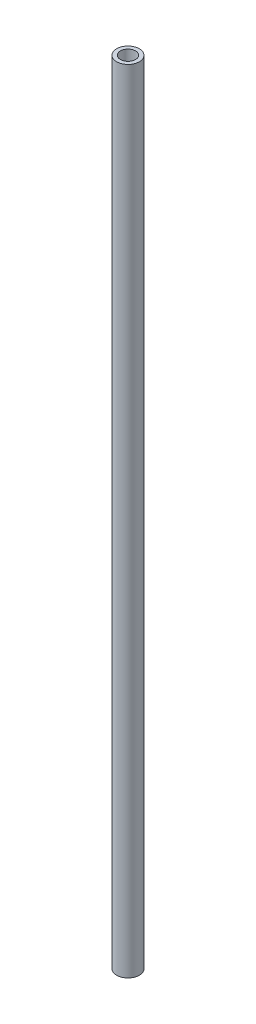
ISO-10303-21;
HEADER;
FILE_DESCRIPTION(('STEP AP214'),'2;1');
FILE_NAME('part.step','',(''),(''),'','','');
FILE_SCHEMA(('AUTOMOTIVE_DESIGN { 1 0 10303 214 1 1 1 1 }'));
ENDSEC;
DATA;
#1=APPLICATION_CONTEXT('core data for automotive mechanical design processes');
#2=APPLICATION_PROTOCOL_DEFINITION('international standard','automotive_design',2000,#1);
#3=PRODUCT_CONTEXT('',#1,'mechanical');
#4=PRODUCT('Part','Part','',(#3));
#5=PRODUCT_RELATED_PRODUCT_CATEGORY('part','',(#4));
#6=PRODUCT_DEFINITION_FORMATION('','',#4);
#7=PRODUCT_DEFINITION_CONTEXT('part definition',#1,'design');
#8=PRODUCT_DEFINITION('design','',#6,#7);
#9=PRODUCT_DEFINITION_SHAPE('','',#8);
#10=(LENGTH_UNIT() NAMED_UNIT(*) SI_UNIT(.MILLI.,.METRE.));
#11=(NAMED_UNIT(*) PLANE_ANGLE_UNIT() SI_UNIT($,.RADIAN.));
#12=(NAMED_UNIT(*) SI_UNIT($,.STERADIAN.) SOLID_ANGLE_UNIT());
#13=UNCERTAINTY_MEASURE_WITH_UNIT(LENGTH_MEASURE(1.E-05),#10,'distance_accuracy_value','');
#14=(GEOMETRIC_REPRESENTATION_CONTEXT(3) GLOBAL_UNCERTAINTY_ASSIGNED_CONTEXT((#13)) GLOBAL_UNIT_ASSIGNED_CONTEXT((#10,
#11,#12)) REPRESENTATION_CONTEXT('',''));
#15=CARTESIAN_POINT('',(0.,0.,0.));
#16=DIRECTION('',(0.,0.,1.));
#17=DIRECTION('',(1.,0.,0.));
#18=AXIS2_PLACEMENT_3D('',#15,#16,#17);
#19=CARTESIAN_POINT('',(0.,420.,0.));
#20=DIRECTION('',(0.,1.,0.));
#21=DIRECTION('',(0.,0.,1.));
#22=AXIS2_PLACEMENT_3D('',#19,#20,#21);
#23=PLANE('',#22);
#24=CARTESIAN_POINT('',(0.,420.,0.));
#25=DIRECTION('',(0.,1.,0.));
#26=DIRECTION('',(0.,0.,1.));
#27=AXIS2_PLACEMENT_3D('',#24,#25,#26);
#28=CIRCLE('',#27,6.);
#29=CARTESIAN_POINT('',(0.,420.,6.));
#30=VERTEX_POINT('',#29);
#31=EDGE_CURVE('E10',#30,#30,#28,.T.);
#32=ORIENTED_EDGE('',*,*,#31,.T.);
#33=EDGE_LOOP('',(#32));
#34=FACE_BOUND('',#33,.T.);
#35=CARTESIAN_POINT('',(0.,420.,0.));
#36=DIRECTION('',(0.,1.,0.));
#37=DIRECTION('',(0.,0.,1.));
#38=AXIS2_PLACEMENT_3D('',#35,#36,#37);
#39=CIRCLE('',#38,4.);
#40=CARTESIAN_POINT('',(0.,420.,4.));
#41=VERTEX_POINT('',#40);
#42=EDGE_CURVE('E45',#41,#41,#39,.T.);
#43=ORIENTED_EDGE('',*,*,#42,.F.);
#44=EDGE_LOOP('',(#43));
#45=FACE_BOUND('',#44,.T.);
#46=ADVANCED_FACE('F34',(#34,#45),#23,.T.);
#47=CARTESIAN_POINT('',(0.,0.,0.));
#48=DIRECTION('',(0.,1.,0.));
#49=DIRECTION('',(0.,0.,1.));
#50=AXIS2_PLACEMENT_3D('',#47,#48,#49);
#51=PLANE('',#50);
#52=CARTESIAN_POINT('',(0.,0.,0.));
#53=DIRECTION('',(0.,1.,0.));
#54=DIRECTION('',(0.,0.,1.));
#55=AXIS2_PLACEMENT_3D('',#52,#53,#54);
#56=CIRCLE('',#55,6.);
#57=CARTESIAN_POINT('',(0.,0.,6.));
#58=VERTEX_POINT('',#57);
#59=EDGE_CURVE('E38',#58,#58,#56,.T.);
#60=ORIENTED_EDGE('',*,*,#59,.F.);
#61=EDGE_LOOP('',(#60));
#62=FACE_BOUND('',#61,.T.);
#63=CARTESIAN_POINT('',(0.,0.,0.));
#64=DIRECTION('',(0.,1.,0.));
#65=DIRECTION('',(0.,0.,1.));
#66=AXIS2_PLACEMENT_3D('',#63,#64,#65);
#67=CIRCLE('',#66,4.);
#68=CARTESIAN_POINT('',(0.,0.,4.));
#69=VERTEX_POINT('',#68);
#70=EDGE_CURVE('E47',#69,#69,#67,.T.);
#71=ORIENTED_EDGE('',*,*,#70,.T.);
#72=EDGE_LOOP('',(#71));
#73=FACE_BOUND('',#72,.T.);
#74=ADVANCED_FACE('F57',(#62,#73),#51,.F.);
#75=CARTESIAN_POINT('',(0.,420.,0.));
#76=DIRECTION('',(0.,-1.,0.));
#77=DIRECTION('',(0.,0.,-1.));
#78=AXIS2_PLACEMENT_3D('',#75,#76,#77);
#79=CYLINDRICAL_SURFACE('',#78,6.);
#80=ORIENTED_EDGE('',*,*,#31,.F.);
#81=EDGE_LOOP('',(#80));
#82=FACE_BOUND('',#81,.T.);
#83=ORIENTED_EDGE('',*,*,#59,.T.);
#84=EDGE_LOOP('',(#83));
#85=FACE_BOUND('',#84,.T.);
#86=ADVANCED_FACE('F36',(#82,#85),#79,.T.);
#87=CARTESIAN_POINT('',(0.,420.,0.));
#88=DIRECTION('',(0.,-1.,0.));
#89=DIRECTION('',(0.,0.,-1.));
#90=AXIS2_PLACEMENT_3D('',#87,#88,#89);
#91=CYLINDRICAL_SURFACE('',#90,4.);
#92=ORIENTED_EDGE('',*,*,#42,.T.);
#93=EDGE_LOOP('',(#92));
#94=FACE_BOUND('',#93,.T.);
#95=ORIENTED_EDGE('',*,*,#70,.F.);
#96=EDGE_LOOP('',(#95));
#97=FACE_BOUND('',#96,.T.);
#98=ADVANCED_FACE('F53',(#94,#97),#91,.F.);
#99=CLOSED_SHELL('',(#46,#74,#86,#98));
#100=MANIFOLD_SOLID_BREP('B2',#99);
#101=ADVANCED_BREP_SHAPE_REPRESENTATION('',(#18,#100),#14);
#102=SHAPE_DEFINITION_REPRESENTATION(#9,#101);
ENDSEC;
END-ISO-10303-21;
